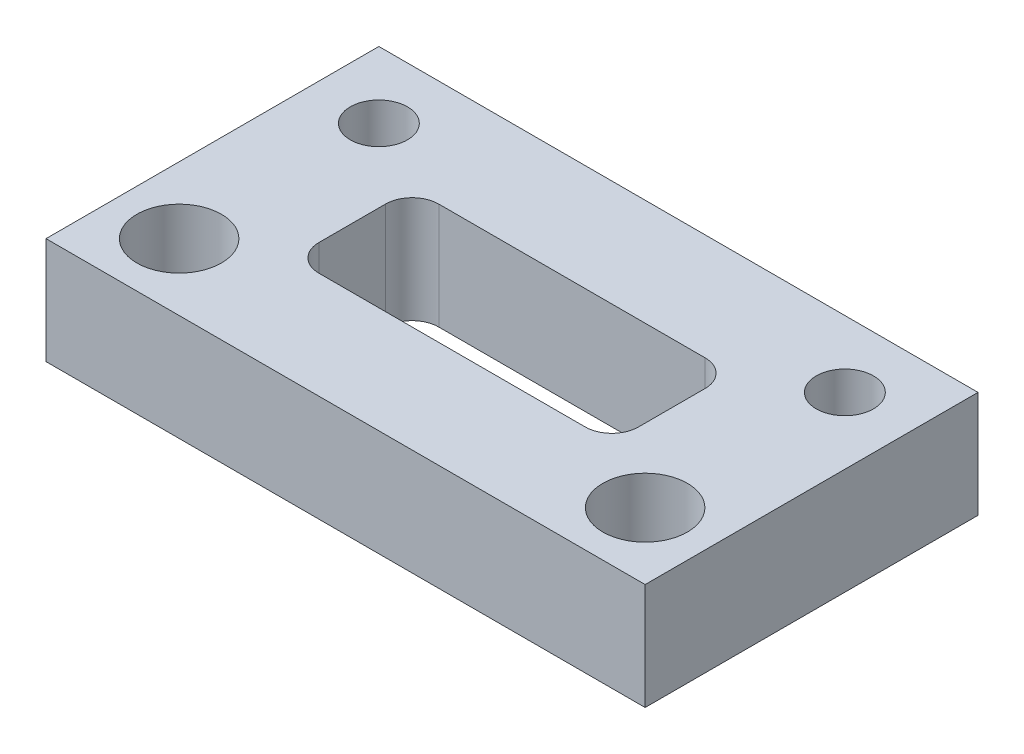
ISO-10303-21;
HEADER;
FILE_DESCRIPTION(('STEP AP214'),'2;1');
FILE_NAME('part.step','',(''),(''),'','','');
FILE_SCHEMA(('AUTOMOTIVE_DESIGN { 1 0 10303 214 1 1 1 1 }'));
ENDSEC;
DATA;
#1=APPLICATION_CONTEXT('core data for automotive mechanical design processes');
#2=APPLICATION_PROTOCOL_DEFINITION('international standard','automotive_design',2000,#1);
#3=PRODUCT_CONTEXT('',#1,'mechanical');
#4=PRODUCT('Part','Part','',(#3));
#5=PRODUCT_RELATED_PRODUCT_CATEGORY('part','',(#4));
#6=PRODUCT_DEFINITION_FORMATION('','',#4);
#7=PRODUCT_DEFINITION_CONTEXT('part definition',#1,'design');
#8=PRODUCT_DEFINITION('design','',#6,#7);
#9=PRODUCT_DEFINITION_SHAPE('','',#8);
#10=(LENGTH_UNIT() NAMED_UNIT(*) SI_UNIT(.MILLI.,.METRE.));
#11=(NAMED_UNIT(*) PLANE_ANGLE_UNIT() SI_UNIT($,.RADIAN.));
#12=(NAMED_UNIT(*) SI_UNIT($,.STERADIAN.) SOLID_ANGLE_UNIT());
#13=UNCERTAINTY_MEASURE_WITH_UNIT(LENGTH_MEASURE(1.E-05),#10,'distance_accuracy_value','');
#14=(GEOMETRIC_REPRESENTATION_CONTEXT(3) GLOBAL_UNCERTAINTY_ASSIGNED_CONTEXT((#13)) GLOBAL_UNIT_ASSIGNED_CONTEXT((#10,
#11,#12)) REPRESENTATION_CONTEXT('',''));
#15=CARTESIAN_POINT('',(0.,0.,0.));
#16=DIRECTION('',(0.,0.,1.));
#17=DIRECTION('',(1.,0.,0.));
#18=AXIS2_PLACEMENT_3D('',#15,#16,#17);
#19=CARTESIAN_POINT('',(-22.5,8.,12.5));
#20=DIRECTION('',(1.,0.,0.));
#21=DIRECTION('',(0.,0.,-1.));
#22=AXIS2_PLACEMENT_3D('',#19,#20,#21);
#23=PLANE('',#22);
#24=DIRECTION('',(0.,0.,1.));
#25=VECTOR('',#24,1.);
#26=CARTESIAN_POINT('',(-22.5,0.,12.5));
#27=LINE('',#26,#25);
#28=CARTESIAN_POINT('',(-22.5,0.,-12.5));
#29=VERTEX_POINT('',#28);
#30=CARTESIAN_POINT('',(-22.5,0.,12.5));
#31=VERTEX_POINT('',#30);
#32=EDGE_CURVE('E151',#29,#31,#27,.T.);
#33=ORIENTED_EDGE('',*,*,#32,.T.);
#34=DIRECTION('',(0.,-1.,0.));
#35=VECTOR('',#34,1.);
#36=CARTESIAN_POINT('',(-22.5,8.,12.5));
#37=LINE('',#36,#35);
#38=CARTESIAN_POINT('',(-22.5,8.,12.5));
#39=VERTEX_POINT('',#38);
#40=EDGE_CURVE('E132',#39,#31,#37,.T.);
#41=ORIENTED_EDGE('',*,*,#40,.F.);
#42=DIRECTION('',(0.,0.,1.));
#43=VECTOR('',#42,1.);
#44=CARTESIAN_POINT('',(-22.5,8.,12.5));
#45=LINE('',#44,#43);
#46=CARTESIAN_POINT('',(-22.5,8.,-12.5));
#47=VERTEX_POINT('',#46);
#48=EDGE_CURVE('E139',#47,#39,#45,.T.);
#49=ORIENTED_EDGE('',*,*,#48,.F.);
#50=DIRECTION('',(0.,-1.,0.));
#51=VECTOR('',#50,1.);
#52=CARTESIAN_POINT('',(-22.5,8.,-12.5));
#53=LINE('',#52,#51);
#54=EDGE_CURVE('E250',#47,#29,#53,.T.);
#55=ORIENTED_EDGE('',*,*,#54,.T.);
#56=EDGE_LOOP('',(#33,#41,#49,#55));
#57=FACE_BOUND('',#56,.T.);
#58=ADVANCED_FACE('F38',(#57),#23,.F.);
#59=CARTESIAN_POINT('',(22.5,8.,12.5));
#60=DIRECTION('',(0.,0.,-1.));
#61=DIRECTION('',(-1.,0.,0.));
#62=AXIS2_PLACEMENT_3D('',#59,#60,#61);
#63=PLANE('',#62);
#64=DIRECTION('',(1.,0.,0.));
#65=VECTOR('',#64,1.);
#66=CARTESIAN_POINT('',(22.5,0.,12.5));
#67=LINE('',#66,#65);
#68=CARTESIAN_POINT('',(22.5,0.,12.5));
#69=VERTEX_POINT('',#68);
#70=EDGE_CURVE('E252',#31,#69,#67,.T.);
#71=ORIENTED_EDGE('',*,*,#70,.T.);
#72=DIRECTION('',(0.,-1.,0.));
#73=VECTOR('',#72,1.);
#74=CARTESIAN_POINT('',(22.5,8.,12.5));
#75=LINE('',#74,#73);
#76=CARTESIAN_POINT('',(22.5,8.,12.5));
#77=VERTEX_POINT('',#76);
#78=EDGE_CURVE('E135',#77,#69,#75,.T.);
#79=ORIENTED_EDGE('',*,*,#78,.F.);
#80=DIRECTION('',(1.,0.,0.));
#81=VECTOR('',#80,1.);
#82=CARTESIAN_POINT('',(22.5,8.,12.5));
#83=LINE('',#82,#81);
#84=EDGE_CURVE('E128',#39,#77,#83,.T.);
#85=ORIENTED_EDGE('',*,*,#84,.F.);
#86=ORIENTED_EDGE('',*,*,#40,.T.);
#87=EDGE_LOOP('',(#71,#79,#85,#86));
#88=FACE_BOUND('',#87,.T.);
#89=ADVANCED_FACE('F130',(#88),#63,.F.);
#90=CARTESIAN_POINT('',(22.5,8.,12.5));
#91=DIRECTION('',(-1.,0.,0.));
#92=DIRECTION('',(0.,0.,1.));
#93=AXIS2_PLACEMENT_3D('',#90,#91,#92);
#94=PLANE('',#93);
#95=DIRECTION('',(0.,0.,-1.));
#96=VECTOR('',#95,1.);
#97=CARTESIAN_POINT('',(22.5,0.,12.5));
#98=LINE('',#97,#96);
#99=CARTESIAN_POINT('',(22.5,0.,-12.5));
#100=VERTEX_POINT('',#99);
#101=EDGE_CURVE('E254',#69,#100,#98,.T.);
#102=ORIENTED_EDGE('',*,*,#101,.T.);
#103=DIRECTION('',(0.,-1.,0.));
#104=VECTOR('',#103,1.);
#105=CARTESIAN_POINT('',(22.5,8.,-12.5));
#106=LINE('',#105,#104);
#107=CARTESIAN_POINT('',(22.5,8.,-12.5));
#108=VERTEX_POINT('',#107);
#109=EDGE_CURVE('E156',#108,#100,#106,.T.);
#110=ORIENTED_EDGE('',*,*,#109,.F.);
#111=DIRECTION('',(0.,0.,-1.));
#112=VECTOR('',#111,1.);
#113=CARTESIAN_POINT('',(22.5,8.,12.5));
#114=LINE('',#113,#112);
#115=EDGE_CURVE('E138',#77,#108,#114,.T.);
#116=ORIENTED_EDGE('',*,*,#115,.F.);
#117=ORIENTED_EDGE('',*,*,#78,.T.);
#118=EDGE_LOOP('',(#102,#110,#116,#117));
#119=FACE_BOUND('',#118,.T.);
#120=ADVANCED_FACE('F265',(#119),#94,.F.);
#121=CARTESIAN_POINT('',(22.5,8.,-12.5));
#122=DIRECTION('',(0.,0.,1.));
#123=DIRECTION('',(1.,0.,0.));
#124=AXIS2_PLACEMENT_3D('',#121,#122,#123);
#125=PLANE('',#124);
#126=DIRECTION('',(-1.,0.,0.));
#127=VECTOR('',#126,1.);
#128=CARTESIAN_POINT('',(22.5,0.,-12.5));
#129=LINE('',#128,#127);
#130=EDGE_CURVE('E148',#100,#29,#129,.T.);
#131=ORIENTED_EDGE('',*,*,#130,.T.);
#132=ORIENTED_EDGE('',*,*,#54,.F.);
#133=DIRECTION('',(-1.,0.,0.));
#134=VECTOR('',#133,1.);
#135=CARTESIAN_POINT('',(22.5,8.,-12.5));
#136=LINE('',#135,#134);
#137=EDGE_CURVE('E144',#108,#47,#136,.T.);
#138=ORIENTED_EDGE('',*,*,#137,.F.);
#139=ORIENTED_EDGE('',*,*,#109,.T.);
#140=EDGE_LOOP('',(#131,#132,#138,#139));
#141=FACE_BOUND('',#140,.T.);
#142=ADVANCED_FACE('F261',(#141),#125,.F.);
#143=CARTESIAN_POINT('',(0.,8.,0.));
#144=DIRECTION('',(0.,1.,0.));
#145=DIRECTION('',(0.,0.,1.));
#146=AXIS2_PLACEMENT_3D('',#143,#144,#145);
#147=PLANE('',#146);
#148=DIRECTION('',(0.,0.,1.));
#149=VECTOR('',#148,1.);
#150=CARTESIAN_POINT('',(-12.,8.,4.5));
#151=LINE('',#150,#149);
#152=CARTESIAN_POINT('',(-12.,8.,-2.5));
#153=VERTEX_POINT('',#152);
#154=CARTESIAN_POINT('',(-12.,8.,2.5));
#155=VERTEX_POINT('',#154);
#156=EDGE_CURVE('E190',#153,#155,#151,.T.);
#157=ORIENTED_EDGE('',*,*,#156,.F.);
#158=CARTESIAN_POINT('',(-10.,8.,-2.5));
#159=DIRECTION('',(0.,1.,0.));
#160=DIRECTION('',(0.,0.,1.));
#161=AXIS2_PLACEMENT_3D('',#158,#159,#160);
#162=CIRCLE('',#161,2.);
#163=CARTESIAN_POINT('',(-10.,8.,-4.5));
#164=VERTEX_POINT('',#163);
#165=EDGE_CURVE('E184',#153,#164,#162,.F.);
#166=ORIENTED_EDGE('',*,*,#165,.T.);
#167=DIRECTION('',(-1.,0.,0.));
#168=VECTOR('',#167,1.);
#169=CARTESIAN_POINT('',(12.,8.,-4.5));
#170=LINE('',#169,#168);
#171=CARTESIAN_POINT('',(10.,8.,-4.5));
#172=VERTEX_POINT('',#171);
#173=EDGE_CURVE('E214',#172,#164,#170,.T.);
#174=ORIENTED_EDGE('',*,*,#173,.F.);
#175=CARTESIAN_POINT('',(10.,8.,-2.5));
#176=DIRECTION('',(0.,1.,0.));
#177=DIRECTION('',(0.,0.,1.));
#178=AXIS2_PLACEMENT_3D('',#175,#176,#177);
#179=CIRCLE('',#178,2.);
#180=CARTESIAN_POINT('',(12.,8.,-2.5));
#181=VERTEX_POINT('',#180);
#182=EDGE_CURVE('E176',#172,#181,#179,.F.);
#183=ORIENTED_EDGE('',*,*,#182,.T.);
#184=DIRECTION('',(0.,0.,-1.));
#185=VECTOR('',#184,1.);
#186=CARTESIAN_POINT('',(12.,8.,4.5));
#187=LINE('',#186,#185);
#188=CARTESIAN_POINT('',(12.,8.,2.5));
#189=VERTEX_POINT('',#188);
#190=EDGE_CURVE('E220',#189,#181,#187,.T.);
#191=ORIENTED_EDGE('',*,*,#190,.F.);
#192=CARTESIAN_POINT('',(10.,8.,2.5));
#193=DIRECTION('',(0.,1.,0.));
#194=DIRECTION('',(0.,0.,1.));
#195=AXIS2_PLACEMENT_3D('',#192,#193,#194);
#196=CIRCLE('',#195,2.);
#197=CARTESIAN_POINT('',(10.,8.,4.5));
#198=VERTEX_POINT('',#197);
#199=EDGE_CURVE('E180',#189,#198,#196,.F.);
#200=ORIENTED_EDGE('',*,*,#199,.T.);
#201=DIRECTION('',(1.,0.,0.));
#202=VECTOR('',#201,1.);
#203=CARTESIAN_POINT('',(12.,8.,4.5));
#204=LINE('',#203,#202);
#205=CARTESIAN_POINT('',(-10.,8.,4.5));
#206=VERTEX_POINT('',#205);
#207=EDGE_CURVE('E192',#206,#198,#204,.T.);
#208=ORIENTED_EDGE('',*,*,#207,.F.);
#209=CARTESIAN_POINT('',(-10.,8.,2.5));
#210=DIRECTION('',(0.,1.,0.));
#211=DIRECTION('',(0.,0.,1.));
#212=AXIS2_PLACEMENT_3D('',#209,#210,#211);
#213=CIRCLE('',#212,2.);
#214=EDGE_CURVE('E46',#206,#155,#213,.F.);
#215=ORIENTED_EDGE('',*,*,#214,.T.);
#216=EDGE_LOOP('',(#157,#166,#174,#183,#191,#200,#208,#215));
#217=FACE_BOUND('',#216,.T.);
#218=CARTESIAN_POINT('',(-17.5,8.,7.5));
#219=DIRECTION('',(0.,1.,0.));
#220=DIRECTION('',(0.,0.,1.));
#221=AXIS2_PLACEMENT_3D('',#218,#219,#220);
#222=CIRCLE('',#221,3.175);
#223=CARTESIAN_POINT('',(-17.5,8.,10.675));
#224=VERTEX_POINT('',#223);
#225=EDGE_CURVE('E217',#224,#224,#222,.T.);
#226=ORIENTED_EDGE('',*,*,#225,.F.);
#227=EDGE_LOOP('',(#226));
#228=FACE_BOUND('',#227,.T.);
#229=CARTESIAN_POINT('',(17.5,8.,7.5));
#230=DIRECTION('',(0.,1.,0.));
#231=DIRECTION('',(0.,0.,1.));
#232=AXIS2_PLACEMENT_3D('',#229,#230,#231);
#233=CIRCLE('',#232,3.175);
#234=CARTESIAN_POINT('',(17.5,8.,10.675));
#235=VERTEX_POINT('',#234);
#236=EDGE_CURVE('E235',#235,#235,#233,.T.);
#237=ORIENTED_EDGE('',*,*,#236,.F.);
#238=EDGE_LOOP('',(#237));
#239=FACE_BOUND('',#238,.T.);
#240=CARTESIAN_POINT('',(17.5,8.,-7.5));
#241=DIRECTION('',(0.,1.,0.));
#242=DIRECTION('',(0.,0.,1.));
#243=AXIS2_PLACEMENT_3D('',#240,#241,#242);
#244=CIRCLE('',#243,2.15);
#245=CARTESIAN_POINT('',(17.5,8.,-5.35));
#246=VERTEX_POINT('',#245);
#247=EDGE_CURVE('E229',#246,#246,#244,.T.);
#248=ORIENTED_EDGE('',*,*,#247,.F.);
#249=EDGE_LOOP('',(#248));
#250=FACE_BOUND('',#249,.T.);
#251=CARTESIAN_POINT('',(-17.5,8.,-7.5));
#252=DIRECTION('',(0.,1.,0.));
#253=DIRECTION('',(0.,0.,1.));
#254=AXIS2_PLACEMENT_3D('',#251,#252,#253);
#255=CIRCLE('',#254,2.15);
#256=CARTESIAN_POINT('',(-17.5,8.,-5.35));
#257=VERTEX_POINT('',#256);
#258=EDGE_CURVE('E228',#257,#257,#255,.T.);
#259=ORIENTED_EDGE('',*,*,#258,.F.);
#260=EDGE_LOOP('',(#259));
#261=FACE_BOUND('',#260,.T.);
#262=ORIENTED_EDGE('',*,*,#48,.T.);
#263=ORIENTED_EDGE('',*,*,#84,.T.);
#264=ORIENTED_EDGE('',*,*,#115,.T.);
#265=ORIENTED_EDGE('',*,*,#137,.T.);
#266=EDGE_LOOP('',(#262,#263,#264,#265));
#267=FACE_BOUND('',#266,.T.);
#268=ADVANCED_FACE('F142',(#217,#228,#239,#250,#261,#267),#147,.T.);
#269=CARTESIAN_POINT('',(0.,0.,0.));
#270=DIRECTION('',(0.,1.,0.));
#271=DIRECTION('',(0.,0.,1.));
#272=AXIS2_PLACEMENT_3D('',#269,#270,#271);
#273=PLANE('',#272);
#274=DIRECTION('',(0.,0.,-1.));
#275=VECTOR('',#274,1.);
#276=CARTESIAN_POINT('',(12.,0.,4.5));
#277=LINE('',#276,#275);
#278=CARTESIAN_POINT('',(12.,0.,2.5));
#279=VERTEX_POINT('',#278);
#280=CARTESIAN_POINT('',(12.,0.,-2.5));
#281=VERTEX_POINT('',#280);
#282=EDGE_CURVE('E210',#279,#281,#277,.T.);
#283=ORIENTED_EDGE('',*,*,#282,.T.);
#284=CARTESIAN_POINT('',(10.,0.,-2.5));
#285=DIRECTION('',(0.,1.,0.));
#286=DIRECTION('',(0.,0.,1.));
#287=AXIS2_PLACEMENT_3D('',#284,#285,#286);
#288=CIRCLE('',#287,2.);
#289=CARTESIAN_POINT('',(10.,0.,-4.5));
#290=VERTEX_POINT('',#289);
#291=EDGE_CURVE('E178',#281,#290,#288,.T.);
#292=ORIENTED_EDGE('',*,*,#291,.T.);
#293=DIRECTION('',(-1.,0.,0.));
#294=VECTOR('',#293,1.);
#295=CARTESIAN_POINT('',(12.,0.,-4.5));
#296=LINE('',#295,#294);
#297=CARTESIAN_POINT('',(-10.,0.,-4.5));
#298=VERTEX_POINT('',#297);
#299=EDGE_CURVE('E212',#290,#298,#296,.T.);
#300=ORIENTED_EDGE('',*,*,#299,.T.);
#301=CARTESIAN_POINT('',(-10.,0.,-2.5));
#302=DIRECTION('',(0.,1.,0.));
#303=DIRECTION('',(0.,0.,1.));
#304=AXIS2_PLACEMENT_3D('',#301,#302,#303);
#305=CIRCLE('',#304,2.);
#306=CARTESIAN_POINT('',(-12.,0.,-2.5));
#307=VERTEX_POINT('',#306);
#308=EDGE_CURVE('E60',#298,#307,#305,.T.);
#309=ORIENTED_EDGE('',*,*,#308,.T.);
#310=DIRECTION('',(0.,0.,1.));
#311=VECTOR('',#310,1.);
#312=CARTESIAN_POINT('',(-12.,0.,4.5));
#313=LINE('',#312,#311);
#314=CARTESIAN_POINT('',(-12.,0.,2.5));
#315=VERTEX_POINT('',#314);
#316=EDGE_CURVE('E206',#307,#315,#313,.T.);
#317=ORIENTED_EDGE('',*,*,#316,.T.);
#318=CARTESIAN_POINT('',(-10.,0.,2.5));
#319=DIRECTION('',(0.,1.,0.));
#320=DIRECTION('',(0.,0.,1.));
#321=AXIS2_PLACEMENT_3D('',#318,#319,#320);
#322=CIRCLE('',#321,2.);
#323=CARTESIAN_POINT('',(-10.,0.,4.5));
#324=VERTEX_POINT('',#323);
#325=EDGE_CURVE('E11',#315,#324,#322,.T.);
#326=ORIENTED_EDGE('',*,*,#325,.T.);
#327=DIRECTION('',(1.,0.,0.));
#328=VECTOR('',#327,1.);
#329=CARTESIAN_POINT('',(12.,0.,4.5));
#330=LINE('',#329,#328);
#331=CARTESIAN_POINT('',(10.,0.,4.5));
#332=VERTEX_POINT('',#331);
#333=EDGE_CURVE('E204',#324,#332,#330,.T.);
#334=ORIENTED_EDGE('',*,*,#333,.T.);
#335=CARTESIAN_POINT('',(10.,0.,2.5));
#336=DIRECTION('',(0.,1.,0.));
#337=DIRECTION('',(0.,0.,1.));
#338=AXIS2_PLACEMENT_3D('',#335,#336,#337);
#339=CIRCLE('',#338,2.);
#340=EDGE_CURVE('E182',#332,#279,#339,.T.);
#341=ORIENTED_EDGE('',*,*,#340,.T.);
#342=EDGE_LOOP('',(#283,#292,#300,#309,#317,#326,#334,#341));
#343=FACE_BOUND('',#342,.T.);
#344=CARTESIAN_POINT('',(-17.5,0.,7.5));
#345=DIRECTION('',(0.,1.,0.));
#346=DIRECTION('',(0.,0.,1.));
#347=AXIS2_PLACEMENT_3D('',#344,#345,#346);
#348=CIRCLE('',#347,3.175);
#349=CARTESIAN_POINT('',(-17.5,0.,10.675));
#350=VERTEX_POINT('',#349);
#351=EDGE_CURVE('E238',#350,#350,#348,.T.);
#352=ORIENTED_EDGE('',*,*,#351,.T.);
#353=EDGE_LOOP('',(#352));
#354=FACE_BOUND('',#353,.T.);
#355=CARTESIAN_POINT('',(17.5,0.,7.5));
#356=DIRECTION('',(0.,1.,0.));
#357=DIRECTION('',(0.,0.,1.));
#358=AXIS2_PLACEMENT_3D('',#355,#356,#357);
#359=CIRCLE('',#358,3.175);
#360=CARTESIAN_POINT('',(17.5,0.,10.675));
#361=VERTEX_POINT('',#360);
#362=EDGE_CURVE('E232',#361,#361,#359,.T.);
#363=ORIENTED_EDGE('',*,*,#362,.T.);
#364=EDGE_LOOP('',(#363));
#365=FACE_BOUND('',#364,.T.);
#366=CARTESIAN_POINT('',(17.5,0.,-7.5));
#367=DIRECTION('',(0.,1.,0.));
#368=DIRECTION('',(0.,0.,1.));
#369=AXIS2_PLACEMENT_3D('',#366,#367,#368);
#370=CIRCLE('',#369,2.15);
#371=CARTESIAN_POINT('',(17.5,0.,-5.35));
#372=VERTEX_POINT('',#371);
#373=EDGE_CURVE('E225',#372,#372,#370,.T.);
#374=ORIENTED_EDGE('',*,*,#373,.T.);
#375=EDGE_LOOP('',(#374));
#376=FACE_BOUND('',#375,.T.);
#377=CARTESIAN_POINT('',(-17.5,0.,-7.5));
#378=DIRECTION('',(0.,1.,0.));
#379=DIRECTION('',(0.,0.,1.));
#380=AXIS2_PLACEMENT_3D('',#377,#378,#379);
#381=CIRCLE('',#380,2.15);
#382=CARTESIAN_POINT('',(-17.5,0.,-5.35));
#383=VERTEX_POINT('',#382);
#384=EDGE_CURVE('E243',#383,#383,#381,.T.);
#385=ORIENTED_EDGE('',*,*,#384,.T.);
#386=EDGE_LOOP('',(#385));
#387=FACE_BOUND('',#386,.T.);
#388=ORIENTED_EDGE('',*,*,#32,.F.);
#389=ORIENTED_EDGE('',*,*,#130,.F.);
#390=ORIENTED_EDGE('',*,*,#101,.F.);
#391=ORIENTED_EDGE('',*,*,#70,.F.);
#392=EDGE_LOOP('',(#388,#389,#390,#391));
#393=FACE_BOUND('',#392,.T.);
#394=ADVANCED_FACE('F202',(#343,#354,#365,#376,#387,#393),#273,.F.);
#395=CARTESIAN_POINT('',(-17.5,0.,-7.5));
#396=DIRECTION('',(0.,1.,0.));
#397=DIRECTION('',(0.,0.,1.));
#398=AXIS2_PLACEMENT_3D('',#395,#396,#397);
#399=CYLINDRICAL_SURFACE('',#398,2.15);
#400=ORIENTED_EDGE('',*,*,#384,.F.);
#401=EDGE_LOOP('',(#400));
#402=FACE_BOUND('',#401,.T.);
#403=ORIENTED_EDGE('',*,*,#258,.T.);
#404=EDGE_LOOP('',(#403));
#405=FACE_BOUND('',#404,.T.);
#406=ADVANCED_FACE('F321',(#402,#405),#399,.F.);
#407=CARTESIAN_POINT('',(17.5,0.,-7.5));
#408=DIRECTION('',(0.,1.,0.));
#409=DIRECTION('',(0.,0.,1.));
#410=AXIS2_PLACEMENT_3D('',#407,#408,#409);
#411=CYLINDRICAL_SURFACE('',#410,2.15);
#412=ORIENTED_EDGE('',*,*,#373,.F.);
#413=EDGE_LOOP('',(#412));
#414=FACE_BOUND('',#413,.T.);
#415=ORIENTED_EDGE('',*,*,#247,.T.);
#416=EDGE_LOOP('',(#415));
#417=FACE_BOUND('',#416,.T.);
#418=ADVANCED_FACE('F317',(#414,#417),#411,.F.);
#419=CARTESIAN_POINT('',(17.5,0.,7.5));
#420=DIRECTION('',(0.,1.,0.));
#421=DIRECTION('',(0.,0.,1.));
#422=AXIS2_PLACEMENT_3D('',#419,#420,#421);
#423=CYLINDRICAL_SURFACE('',#422,3.175);
#424=ORIENTED_EDGE('',*,*,#362,.F.);
#425=EDGE_LOOP('',(#424));
#426=FACE_BOUND('',#425,.T.);
#427=ORIENTED_EDGE('',*,*,#236,.T.);
#428=EDGE_LOOP('',(#427));
#429=FACE_BOUND('',#428,.T.);
#430=ADVANCED_FACE('F320',(#426,#429),#423,.F.);
#431=CARTESIAN_POINT('',(-17.5,0.,7.5));
#432=DIRECTION('',(0.,1.,0.));
#433=DIRECTION('',(0.,0.,1.));
#434=AXIS2_PLACEMENT_3D('',#431,#432,#433);
#435=CYLINDRICAL_SURFACE('',#434,3.175);
#436=ORIENTED_EDGE('',*,*,#351,.F.);
#437=EDGE_LOOP('',(#436));
#438=FACE_BOUND('',#437,.T.);
#439=ORIENTED_EDGE('',*,*,#225,.T.);
#440=EDGE_LOOP('',(#439));
#441=FACE_BOUND('',#440,.T.);
#442=ADVANCED_FACE('F316',(#438,#441),#435,.F.);
#443=CARTESIAN_POINT('',(-12.,0.,4.5));
#444=DIRECTION('',(-1.,0.,0.));
#445=DIRECTION('',(0.,0.,1.));
#446=AXIS2_PLACEMENT_3D('',#443,#444,#445);
#447=PLANE('',#446);
#448=ORIENTED_EDGE('',*,*,#316,.F.);
#449=DIRECTION('',(0.,1.,0.));
#450=VECTOR('',#449,1.);
#451=CARTESIAN_POINT('',(-12.,8.,-2.5));
#452=LINE('',#451,#450);
#453=EDGE_CURVE('E173',#307,#153,#452,.T.);
#454=ORIENTED_EDGE('',*,*,#453,.T.);
#455=ORIENTED_EDGE('',*,*,#156,.T.);
#456=DIRECTION('',(0.,1.,0.));
#457=VECTOR('',#456,1.);
#458=CARTESIAN_POINT('',(-12.,0.,2.5));
#459=LINE('',#458,#457);
#460=EDGE_CURVE('E53',#155,#315,#459,.F.);
#461=ORIENTED_EDGE('',*,*,#460,.T.);
#462=EDGE_LOOP('',(#448,#454,#455,#461));
#463=FACE_BOUND('',#462,.T.);
#464=ADVANCED_FACE('F195',(#463),#447,.F.);
#465=CARTESIAN_POINT('',(12.,0.,-4.5));
#466=DIRECTION('',(0.,0.,-1.));
#467=DIRECTION('',(-1.,0.,0.));
#468=AXIS2_PLACEMENT_3D('',#465,#466,#467);
#469=PLANE('',#468);
#470=ORIENTED_EDGE('',*,*,#299,.F.);
#471=DIRECTION('',(0.,1.,0.));
#472=VECTOR('',#471,1.);
#473=CARTESIAN_POINT('',(10.,8.,-4.5));
#474=LINE('',#473,#472);
#475=EDGE_CURVE('E154',#290,#172,#474,.T.);
#476=ORIENTED_EDGE('',*,*,#475,.T.);
#477=ORIENTED_EDGE('',*,*,#173,.T.);
#478=DIRECTION('',(0.,1.,0.));
#479=VECTOR('',#478,1.);
#480=CARTESIAN_POINT('',(-10.,0.,-4.5));
#481=LINE('',#480,#479);
#482=EDGE_CURVE('E152',#164,#298,#481,.F.);
#483=ORIENTED_EDGE('',*,*,#482,.T.);
#484=EDGE_LOOP('',(#470,#476,#477,#483));
#485=FACE_BOUND('',#484,.T.);
#486=ADVANCED_FACE('F296',(#485),#469,.F.);
#487=CARTESIAN_POINT('',(12.,0.,4.5));
#488=DIRECTION('',(1.,0.,0.));
#489=DIRECTION('',(0.,0.,-1.));
#490=AXIS2_PLACEMENT_3D('',#487,#488,#489);
#491=PLANE('',#490);
#492=ORIENTED_EDGE('',*,*,#190,.T.);
#493=DIRECTION('',(0.,1.,0.));
#494=VECTOR('',#493,1.);
#495=CARTESIAN_POINT('',(12.,0.,-2.5));
#496=LINE('',#495,#494);
#497=EDGE_CURVE('E165',#181,#281,#496,.F.);
#498=ORIENTED_EDGE('',*,*,#497,.T.);
#499=ORIENTED_EDGE('',*,*,#282,.F.);
#500=DIRECTION('',(0.,1.,0.));
#501=VECTOR('',#500,1.);
#502=CARTESIAN_POINT('',(12.,8.,2.5));
#503=LINE('',#502,#501);
#504=EDGE_CURVE('E162',#279,#189,#503,.T.);
#505=ORIENTED_EDGE('',*,*,#504,.T.);
#506=EDGE_LOOP('',(#492,#498,#499,#505));
#507=FACE_BOUND('',#506,.T.);
#508=ADVANCED_FACE('F302',(#507),#491,.F.);
#509=CARTESIAN_POINT('',(12.,0.,4.5));
#510=DIRECTION('',(0.,0.,1.));
#511=DIRECTION('',(1.,0.,0.));
#512=AXIS2_PLACEMENT_3D('',#509,#510,#511);
#513=PLANE('',#512);
#514=ORIENTED_EDGE('',*,*,#207,.T.);
#515=DIRECTION('',(0.,1.,0.));
#516=VECTOR('',#515,1.);
#517=CARTESIAN_POINT('',(10.,0.,4.5));
#518=LINE('',#517,#516);
#519=EDGE_CURVE('E170',#198,#332,#518,.F.);
#520=ORIENTED_EDGE('',*,*,#519,.T.);
#521=ORIENTED_EDGE('',*,*,#333,.F.);
#522=DIRECTION('',(0.,1.,0.));
#523=VECTOR('',#522,1.);
#524=CARTESIAN_POINT('',(-10.,8.,4.5));
#525=LINE('',#524,#523);
#526=EDGE_CURVE('E167',#324,#206,#525,.T.);
#527=ORIENTED_EDGE('',*,*,#526,.T.);
#528=EDGE_LOOP('',(#514,#520,#521,#527));
#529=FACE_BOUND('',#528,.T.);
#530=ADVANCED_FACE('F208',(#529),#513,.F.);
#531=CARTESIAN_POINT('',(10.,0.,-2.5));
#532=DIRECTION('',(0.,-1.,0.));
#533=DIRECTION('',(0.,0.,-1.));
#534=AXIS2_PLACEMENT_3D('',#531,#532,#533);
#535=CYLINDRICAL_SURFACE('',#534,2.);
#536=ORIENTED_EDGE('',*,*,#291,.F.);
#537=ORIENTED_EDGE('',*,*,#497,.F.);
#538=ORIENTED_EDGE('',*,*,#182,.F.);
#539=ORIENTED_EDGE('',*,*,#475,.F.);
#540=EDGE_LOOP('',(#536,#537,#538,#539));
#541=FACE_BOUND('',#540,.T.);
#542=ADVANCED_FACE('F279',(#541),#535,.F.);
#543=CARTESIAN_POINT('',(10.,0.,2.5));
#544=DIRECTION('',(0.,-1.,0.));
#545=DIRECTION('',(0.,0.,-1.));
#546=AXIS2_PLACEMENT_3D('',#543,#544,#545);
#547=CYLINDRICAL_SURFACE('',#546,2.);
#548=ORIENTED_EDGE('',*,*,#340,.F.);
#549=ORIENTED_EDGE('',*,*,#519,.F.);
#550=ORIENTED_EDGE('',*,*,#199,.F.);
#551=ORIENTED_EDGE('',*,*,#504,.F.);
#552=EDGE_LOOP('',(#548,#549,#550,#551));
#553=FACE_BOUND('',#552,.T.);
#554=ADVANCED_FACE('F282',(#553),#547,.F.);
#555=CARTESIAN_POINT('',(-10.,0.,-2.5));
#556=DIRECTION('',(0.,-1.,0.));
#557=DIRECTION('',(0.,0.,-1.));
#558=AXIS2_PLACEMENT_3D('',#555,#556,#557);
#559=CYLINDRICAL_SURFACE('',#558,2.);
#560=ORIENTED_EDGE('',*,*,#308,.F.);
#561=ORIENTED_EDGE('',*,*,#482,.F.);
#562=ORIENTED_EDGE('',*,*,#165,.F.);
#563=ORIENTED_EDGE('',*,*,#453,.F.);
#564=EDGE_LOOP('',(#560,#561,#562,#563));
#565=FACE_BOUND('',#564,.T.);
#566=ADVANCED_FACE('F285',(#565),#559,.F.);
#567=CARTESIAN_POINT('',(-10.,0.,2.5));
#568=DIRECTION('',(0.,-1.,0.));
#569=DIRECTION('',(0.,0.,-1.));
#570=AXIS2_PLACEMENT_3D('',#567,#568,#569);
#571=CYLINDRICAL_SURFACE('',#570,2.);
#572=ORIENTED_EDGE('',*,*,#325,.F.);
#573=ORIENTED_EDGE('',*,*,#460,.F.);
#574=ORIENTED_EDGE('',*,*,#214,.F.);
#575=ORIENTED_EDGE('',*,*,#526,.F.);
#576=EDGE_LOOP('',(#572,#573,#574,#575));
#577=FACE_BOUND('',#576,.T.);
#578=ADVANCED_FACE('F40',(#577),#571,.F.);
#579=CLOSED_SHELL('',(#58,#89,#120,#142,#268,#394,#406,#418,#430,#442,#464,#486,#508,#530,#542,
#554,#566,#578));
#580=MANIFOLD_SOLID_BREP('B2',#579);
#581=ADVANCED_BREP_SHAPE_REPRESENTATION('',(#18,#580),#14);
#582=SHAPE_DEFINITION_REPRESENTATION(#9,#581);
ENDSEC;
END-ISO-10303-21;
